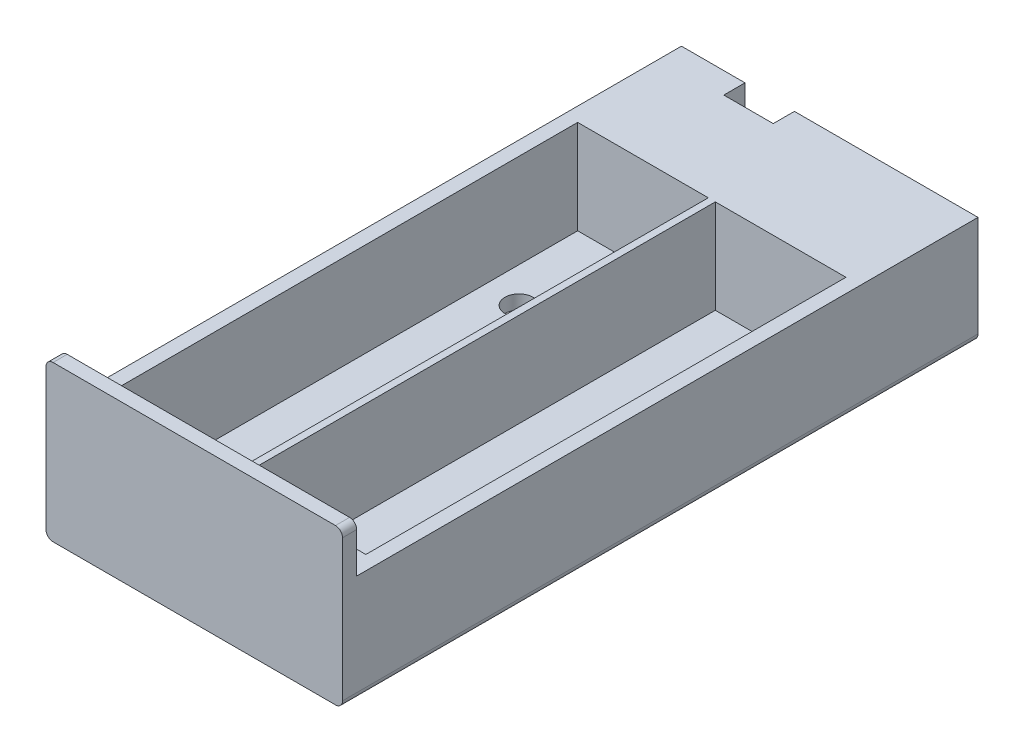
ISO-10303-21;
HEADER;
FILE_DESCRIPTION(('STEP AP214'),'2;1');
FILE_NAME('part.step','',(''),(''),'','','');
FILE_SCHEMA(('AUTOMOTIVE_DESIGN { 1 0 10303 214 1 1 1 1 }'));
ENDSEC;
DATA;
#1=APPLICATION_CONTEXT('core data for automotive mechanical design processes');
#2=APPLICATION_PROTOCOL_DEFINITION('international standard','automotive_design',2000,#1);
#3=PRODUCT_CONTEXT('',#1,'mechanical');
#4=PRODUCT('Part','Part','',(#3));
#5=PRODUCT_RELATED_PRODUCT_CATEGORY('part','',(#4));
#6=PRODUCT_DEFINITION_FORMATION('','',#4);
#7=PRODUCT_DEFINITION_CONTEXT('part definition',#1,'design');
#8=PRODUCT_DEFINITION('design','',#6,#7);
#9=PRODUCT_DEFINITION_SHAPE('','',#8);
#10=(LENGTH_UNIT() NAMED_UNIT(*) SI_UNIT(.MILLI.,.METRE.));
#11=(NAMED_UNIT(*) PLANE_ANGLE_UNIT() SI_UNIT($,.RADIAN.));
#12=(NAMED_UNIT(*) SI_UNIT($,.STERADIAN.) SOLID_ANGLE_UNIT());
#13=UNCERTAINTY_MEASURE_WITH_UNIT(LENGTH_MEASURE(1.E-05),#10,'distance_accuracy_value','');
#14=(GEOMETRIC_REPRESENTATION_CONTEXT(3) GLOBAL_UNCERTAINTY_ASSIGNED_CONTEXT((#13)) GLOBAL_UNIT_ASSIGNED_CONTEXT((#10,
#11,#12)) REPRESENTATION_CONTEXT('',''));
#15=CARTESIAN_POINT('',(0.,0.,0.));
#16=DIRECTION('',(0.,0.,1.));
#17=DIRECTION('',(1.,0.,0.));
#18=AXIS2_PLACEMENT_3D('',#15,#16,#17);
#19=CARTESIAN_POINT('',(-21.,22.,-45.));
#20=DIRECTION('',(0.,0.,1.));
#21=DIRECTION('',(1.,0.,0.));
#22=AXIS2_PLACEMENT_3D('',#19,#20,#21);
#23=PLANE('',#22);
#24=CARTESIAN_POINT('',(13.5,3.5,-45.));
#25=DIRECTION('',(0.,0.,-1.));
#26=DIRECTION('',(-1.,0.,0.));
#27=AXIS2_PLACEMENT_3D('',#24,#25,#26);
#28=CIRCLE('',#27,1.5);
#29=CARTESIAN_POINT('',(12.,3.5,-45.));
#30=VERTEX_POINT('',#29);
#31=EDGE_CURVE('E224',#30,#30,#28,.T.);
#32=ORIENTED_EDGE('',*,*,#31,.F.);
#33=EDGE_LOOP('',(#32));
#34=FACE_BOUND('',#33,.T.);
#35=DIRECTION('',(-1.,0.,0.));
#36=VECTOR('',#35,1.);
#37=CARTESIAN_POINT('',(-21.,15.3,-45.));
#38=LINE('',#37,#36);
#39=CARTESIAN_POINT('',(-12.,15.3,-45.));
#40=VERTEX_POINT('',#39);
#41=CARTESIAN_POINT('',(-21.,15.3,-45.));
#42=VERTEX_POINT('',#41);
#43=EDGE_CURVE('E236',#40,#42,#38,.T.);
#44=ORIENTED_EDGE('',*,*,#43,.F.);
#45=DIRECTION('',(0.,1.,0.));
#46=VECTOR('',#45,1.);
#47=CARTESIAN_POINT('',(-12.,15.3,-45.));
#48=LINE('',#47,#46);
#49=CARTESIAN_POINT('',(-12.,10.3,-45.));
#50=VERTEX_POINT('',#49);
#51=EDGE_CURVE('E368',#50,#40,#48,.T.);
#52=ORIENTED_EDGE('',*,*,#51,.F.);
#53=DIRECTION('',(-1.,0.,0.));
#54=VECTOR('',#53,1.);
#55=CARTESIAN_POINT('',(-12.,10.3,-45.));
#56=LINE('',#55,#54);
#57=CARTESIAN_POINT('',(-5.00000000000001,10.3,-45.));
#58=VERTEX_POINT('',#57);
#59=EDGE_CURVE('E375',#58,#50,#56,.T.);
#60=ORIENTED_EDGE('',*,*,#59,.F.);
#61=DIRECTION('',(0.,-1.,0.));
#62=VECTOR('',#61,1.);
#63=CARTESIAN_POINT('',(-5.00000000000001,15.3,-45.));
#64=LINE('',#63,#62);
#65=CARTESIAN_POINT('',(-5.00000000000001,15.3,-45.));
#66=VERTEX_POINT('',#65);
#67=EDGE_CURVE('E371',#66,#58,#64,.T.);
#68=ORIENTED_EDGE('',*,*,#67,.F.);
#69=CARTESIAN_POINT('',(21.,15.3,-45.));
#70=VERTEX_POINT('',#69);
#71=EDGE_CURVE('E215',#70,#66,#38,.T.);
#72=ORIENTED_EDGE('',*,*,#71,.F.);
#73=DIRECTION('',(0.,-1.,0.));
#74=VECTOR('',#73,1.);
#75=CARTESIAN_POINT('',(21.,22.,-45.));
#76=LINE('',#75,#74);
#77=CARTESIAN_POINT('',(21.,1.,-45.));
#78=VERTEX_POINT('',#77);
#79=EDGE_CURVE('E321',#70,#78,#76,.T.);
#80=ORIENTED_EDGE('',*,*,#79,.T.);
#81=CARTESIAN_POINT('',(20.,1.,-45.));
#82=DIRECTION('',(0.,0.,1.));
#83=DIRECTION('',(1.,0.,0.));
#84=AXIS2_PLACEMENT_3D('',#81,#82,#83);
#85=CIRCLE('',#84,1.);
#86=CARTESIAN_POINT('',(20.,0.,-45.));
#87=VERTEX_POINT('',#86);
#88=EDGE_CURVE('E331',#78,#87,#85,.F.);
#89=ORIENTED_EDGE('',*,*,#88,.T.);
#90=DIRECTION('',(-1.,0.,0.));
#91=VECTOR('',#90,1.);
#92=CARTESIAN_POINT('',(-21.,0.,-45.));
#93=LINE('',#92,#91);
#94=CARTESIAN_POINT('',(-20.,0.,-45.));
#95=VERTEX_POINT('',#94);
#96=EDGE_CURVE('E296',#87,#95,#93,.T.);
#97=ORIENTED_EDGE('',*,*,#96,.T.);
#98=CARTESIAN_POINT('',(-20.,1.,-45.));
#99=DIRECTION('',(0.,0.,1.));
#100=DIRECTION('',(1.,0.,0.));
#101=AXIS2_PLACEMENT_3D('',#98,#99,#100);
#102=CIRCLE('',#101,1.);
#103=CARTESIAN_POINT('',(-21.,1.,-45.));
#104=VERTEX_POINT('',#103);
#105=EDGE_CURVE('E328',#95,#104,#102,.F.);
#106=ORIENTED_EDGE('',*,*,#105,.T.);
#107=DIRECTION('',(0.,-1.,0.));
#108=VECTOR('',#107,1.);
#109=CARTESIAN_POINT('',(-21.,22.,-45.));
#110=LINE('',#109,#108);
#111=EDGE_CURVE('E319',#42,#104,#110,.T.);
#112=ORIENTED_EDGE('',*,*,#111,.F.);
#113=EDGE_LOOP('',(#44,#52,#60,#68,#72,#80,#89,#97,#106,#112));
#114=FACE_BOUND('',#113,.T.);
#115=ADVANCED_FACE('F42',(#34,#114),#23,.F.);
#116=CARTESIAN_POINT('',(0.,22.,0.));
#117=DIRECTION('',(0.,-1.,0.));
#118=DIRECTION('',(0.,0.,-1.));
#119=AXIS2_PLACEMENT_3D('',#116,#117,#118);
#120=PLANE('',#119);
#121=DIRECTION('',(0.,0.,-1.));
#122=VECTOR('',#121,1.);
#123=CARTESIAN_POINT('',(20.,22.,0.));
#124=LINE('',#123,#122);
#125=CARTESIAN_POINT('',(20.,22.,45.));
#126=VERTEX_POINT('',#125);
#127=CARTESIAN_POINT('',(20.,22.,43.));
#128=VERTEX_POINT('',#127);
#129=EDGE_CURVE('E353',#126,#128,#124,.T.);
#130=ORIENTED_EDGE('',*,*,#129,.T.);
#131=DIRECTION('',(1.,0.,0.));
#132=VECTOR('',#131,1.);
#133=CARTESIAN_POINT('',(-21.,22.,43.));
#134=LINE('',#133,#132);
#135=CARTESIAN_POINT('',(-20.,22.,43.));
#136=VERTEX_POINT('',#135);
#137=EDGE_CURVE('E227',#136,#128,#134,.T.);
#138=ORIENTED_EDGE('',*,*,#137,.F.);
#139=DIRECTION('',(0.,0.,1.));
#140=VECTOR('',#139,1.);
#141=CARTESIAN_POINT('',(-20.,22.,0.));
#142=LINE('',#141,#140);
#143=CARTESIAN_POINT('',(-20.,22.,45.));
#144=VERTEX_POINT('',#143);
#145=EDGE_CURVE('E351',#136,#144,#142,.T.);
#146=ORIENTED_EDGE('',*,*,#145,.T.);
#147=DIRECTION('',(1.,0.,0.));
#148=VECTOR('',#147,1.);
#149=CARTESIAN_POINT('',(-21.,22.,45.));
#150=LINE('',#149,#148);
#151=EDGE_CURVE('E305',#144,#126,#150,.T.);
#152=ORIENTED_EDGE('',*,*,#151,.T.);
#153=EDGE_LOOP('',(#130,#138,#146,#152));
#154=FACE_BOUND('',#153,.T.);
#155=ADVANCED_FACE('F402',(#154),#120,.F.);
#156=CARTESIAN_POINT('',(21.,22.,45.));
#157=DIRECTION('',(-1.,0.,0.));
#158=DIRECTION('',(0.,0.,1.));
#159=AXIS2_PLACEMENT_3D('',#156,#157,#158);
#160=PLANE('',#159);
#161=DIRECTION('',(0.,0.,-1.));
#162=VECTOR('',#161,1.);
#163=CARTESIAN_POINT('',(21.,15.3,-45.));
#164=LINE('',#163,#162);
#165=CARTESIAN_POINT('',(21.,15.3,43.));
#166=VERTEX_POINT('',#165);
#167=EDGE_CURVE('E234',#166,#70,#164,.T.);
#168=ORIENTED_EDGE('',*,*,#167,.F.);
#169=DIRECTION('',(0.,1.,0.));
#170=VECTOR('',#169,1.);
#171=CARTESIAN_POINT('',(21.,15.3,43.));
#172=LINE('',#171,#170);
#173=CARTESIAN_POINT('',(21.,21.,43.));
#174=VERTEX_POINT('',#173);
#175=EDGE_CURVE('E240',#166,#174,#172,.T.);
#176=ORIENTED_EDGE('',*,*,#175,.T.);
#177=DIRECTION('',(0.,0.,-1.));
#178=VECTOR('',#177,1.);
#179=CARTESIAN_POINT('',(21.,21.,45.));
#180=LINE('',#179,#178);
#181=CARTESIAN_POINT('',(21.,21.,45.));
#182=VERTEX_POINT('',#181);
#183=EDGE_CURVE('E323',#174,#182,#180,.F.);
#184=ORIENTED_EDGE('',*,*,#183,.T.);
#185=DIRECTION('',(0.,-1.,0.));
#186=VECTOR('',#185,1.);
#187=CARTESIAN_POINT('',(21.,22.,45.));
#188=LINE('',#187,#186);
#189=CARTESIAN_POINT('',(21.,1.,45.));
#190=VERTEX_POINT('',#189);
#191=EDGE_CURVE('E308',#182,#190,#188,.T.);
#192=ORIENTED_EDGE('',*,*,#191,.T.);
#193=DIRECTION('',(0.,0.,-1.));
#194=VECTOR('',#193,1.);
#195=CARTESIAN_POINT('',(21.,1.,-45.));
#196=LINE('',#195,#194);
#197=EDGE_CURVE('E325',#190,#78,#196,.T.);
#198=ORIENTED_EDGE('',*,*,#197,.T.);
#199=ORIENTED_EDGE('',*,*,#79,.F.);
#200=EDGE_LOOP('',(#168,#176,#184,#192,#198,#199));
#201=FACE_BOUND('',#200,.T.);
#202=ADVANCED_FACE('F412',(#201),#160,.F.);
#203=CARTESIAN_POINT('',(-21.,22.,45.));
#204=DIRECTION('',(1.,0.,0.));
#205=DIRECTION('',(0.,0.,-1.));
#206=AXIS2_PLACEMENT_3D('',#203,#204,#205);
#207=PLANE('',#206);
#208=DIRECTION('',(0.,0.,1.));
#209=VECTOR('',#208,1.);
#210=CARTESIAN_POINT('',(-21.,21.,45.));
#211=LINE('',#210,#209);
#212=CARTESIAN_POINT('',(-21.,21.,45.));
#213=VERTEX_POINT('',#212);
#214=CARTESIAN_POINT('',(-21.,21.,43.));
#215=VERTEX_POINT('',#214);
#216=EDGE_CURVE('E345',#213,#215,#211,.F.);
#217=ORIENTED_EDGE('',*,*,#216,.T.);
#218=DIRECTION('',(0.,1.,0.));
#219=VECTOR('',#218,1.);
#220=CARTESIAN_POINT('',(-21.,15.3,43.));
#221=LINE('',#220,#219);
#222=CARTESIAN_POINT('',(-21.,15.3,43.));
#223=VERTEX_POINT('',#222);
#224=EDGE_CURVE('E238',#223,#215,#221,.T.);
#225=ORIENTED_EDGE('',*,*,#224,.F.);
#226=DIRECTION('',(0.,0.,1.));
#227=VECTOR('',#226,1.);
#228=CARTESIAN_POINT('',(-21.,15.3,-45.));
#229=LINE('',#228,#227);
#230=EDGE_CURVE('E228',#42,#223,#229,.T.);
#231=ORIENTED_EDGE('',*,*,#230,.F.);
#232=ORIENTED_EDGE('',*,*,#111,.T.);
#233=DIRECTION('',(0.,0.,1.));
#234=VECTOR('',#233,1.);
#235=CARTESIAN_POINT('',(-21.,1.,45.));
#236=LINE('',#235,#234);
#237=CARTESIAN_POINT('',(-21.,1.,45.));
#238=VERTEX_POINT('',#237);
#239=EDGE_CURVE('E348',#104,#238,#236,.T.);
#240=ORIENTED_EDGE('',*,*,#239,.T.);
#241=DIRECTION('',(0.,-1.,0.));
#242=VECTOR('',#241,1.);
#243=CARTESIAN_POINT('',(-21.,22.,45.));
#244=LINE('',#243,#242);
#245=EDGE_CURVE('E316',#213,#238,#244,.T.);
#246=ORIENTED_EDGE('',*,*,#245,.F.);
#247=EDGE_LOOP('',(#217,#225,#231,#232,#240,#246));
#248=FACE_BOUND('',#247,.T.);
#249=ADVANCED_FACE('F390',(#248),#207,.F.);
#250=CARTESIAN_POINT('',(-21.,22.,45.));
#251=DIRECTION('',(0.,0.,-1.));
#252=DIRECTION('',(-1.,0.,0.));
#253=AXIS2_PLACEMENT_3D('',#250,#251,#252);
#254=PLANE('',#253);
#255=DIRECTION('',(1.,0.,0.));
#256=VECTOR('',#255,1.);
#257=CARTESIAN_POINT('',(-21.,0.,45.));
#258=LINE('',#257,#256);
#259=CARTESIAN_POINT('',(-20.,0.,45.));
#260=VERTEX_POINT('',#259);
#261=CARTESIAN_POINT('',(20.,0.,45.));
#262=VERTEX_POINT('',#261);
#263=EDGE_CURVE('E309',#260,#262,#258,.T.);
#264=ORIENTED_EDGE('',*,*,#263,.T.);
#265=CARTESIAN_POINT('',(20.,1.,45.));
#266=DIRECTION('',(0.,0.,-1.));
#267=DIRECTION('',(-1.,0.,0.));
#268=AXIS2_PLACEMENT_3D('',#265,#266,#267);
#269=CIRCLE('',#268,1.);
#270=EDGE_CURVE('E343',#262,#190,#269,.F.);
#271=ORIENTED_EDGE('',*,*,#270,.T.);
#272=ORIENTED_EDGE('',*,*,#191,.F.);
#273=CARTESIAN_POINT('',(20.,21.,45.));
#274=DIRECTION('',(0.,0.,-1.));
#275=DIRECTION('',(-1.,0.,0.));
#276=AXIS2_PLACEMENT_3D('',#273,#274,#275);
#277=CIRCLE('',#276,1.);
#278=EDGE_CURVE('E339',#182,#126,#277,.F.);
#279=ORIENTED_EDGE('',*,*,#278,.T.);
#280=ORIENTED_EDGE('',*,*,#151,.F.);
#281=CARTESIAN_POINT('',(-20.,21.,45.));
#282=DIRECTION('',(0.,0.,-1.));
#283=DIRECTION('',(-1.,0.,0.));
#284=AXIS2_PLACEMENT_3D('',#281,#282,#283);
#285=CIRCLE('',#284,1.);
#286=EDGE_CURVE('E337',#144,#213,#285,.F.);
#287=ORIENTED_EDGE('',*,*,#286,.T.);
#288=ORIENTED_EDGE('',*,*,#245,.T.);
#289=CARTESIAN_POINT('',(-20.,1.,45.));
#290=DIRECTION('',(0.,0.,-1.));
#291=DIRECTION('',(-1.,0.,0.));
#292=AXIS2_PLACEMENT_3D('',#289,#290,#291);
#293=CIRCLE('',#292,1.);
#294=EDGE_CURVE('E341',#238,#260,#293,.F.);
#295=ORIENTED_EDGE('',*,*,#294,.T.);
#296=EDGE_LOOP('',(#264,#271,#272,#279,#280,#287,#288,#295));
#297=FACE_BOUND('',#296,.T.);
#298=ADVANCED_FACE('F415',(#297),#254,.F.);
#299=CARTESIAN_POINT('',(0.,0.,0.));
#300=DIRECTION('',(0.,-1.,0.));
#301=DIRECTION('',(0.,0.,-1.));
#302=AXIS2_PLACEMENT_3D('',#299,#300,#301);
#303=PLANE('',#302);
#304=CARTESIAN_POINT('',(-14.,0.,-15.));
#305=DIRECTION('',(0.,-1.,0.));
#306=DIRECTION('',(0.,0.,-1.));
#307=AXIS2_PLACEMENT_3D('',#304,#305,#306);
#308=CIRCLE('',#307,2.);
#309=CARTESIAN_POINT('',(-14.,0.,-17.));
#310=VERTEX_POINT('',#309);
#311=EDGE_CURVE('E533',#310,#310,#308,.T.);
#312=ORIENTED_EDGE('',*,*,#311,.F.);
#313=EDGE_LOOP('',(#312));
#314=FACE_BOUND('',#313,.T.);
#315=CARTESIAN_POINT('',(-14.,0.,25.));
#316=DIRECTION('',(0.,-1.,0.));
#317=DIRECTION('',(0.,0.,-1.));
#318=AXIS2_PLACEMENT_3D('',#315,#316,#317);
#319=CIRCLE('',#318,2.);
#320=CARTESIAN_POINT('',(-14.,0.,23.));
#321=VERTEX_POINT('',#320);
#322=EDGE_CURVE('E528',#321,#321,#319,.T.);
#323=ORIENTED_EDGE('',*,*,#322,.F.);
#324=EDGE_LOOP('',(#323));
#325=FACE_BOUND('',#324,.T.);
#326=CARTESIAN_POINT('',(14.,0.,25.));
#327=DIRECTION('',(0.,-1.,0.));
#328=DIRECTION('',(0.,0.,-1.));
#329=AXIS2_PLACEMENT_3D('',#326,#327,#328);
#330=CIRCLE('',#329,2.00000000000001);
#331=CARTESIAN_POINT('',(14.,0.,23.));
#332=VERTEX_POINT('',#331);
#333=EDGE_CURVE('E526',#332,#332,#330,.T.);
#334=ORIENTED_EDGE('',*,*,#333,.F.);
#335=EDGE_LOOP('',(#334));
#336=FACE_BOUND('',#335,.T.);
#337=CARTESIAN_POINT('',(14.,0.,-15.));
#338=DIRECTION('',(0.,-1.,0.));
#339=DIRECTION('',(0.,0.,-1.));
#340=AXIS2_PLACEMENT_3D('',#337,#338,#339);
#341=CIRCLE('',#340,2.00000000000001);
#342=CARTESIAN_POINT('',(14.,0.,-17.));
#343=VERTEX_POINT('',#342);
#344=EDGE_CURVE('E361',#343,#343,#341,.T.);
#345=ORIENTED_EDGE('',*,*,#344,.F.);
#346=EDGE_LOOP('',(#345));
#347=FACE_BOUND('',#346,.T.);
#348=ORIENTED_EDGE('',*,*,#96,.F.);
#349=DIRECTION('',(0.,0.,-1.));
#350=VECTOR('',#349,1.);
#351=CARTESIAN_POINT('',(20.,0.,45.));
#352=LINE('',#351,#350);
#353=EDGE_CURVE('E335',#87,#262,#352,.F.);
#354=ORIENTED_EDGE('',*,*,#353,.T.);
#355=ORIENTED_EDGE('',*,*,#263,.F.);
#356=DIRECTION('',(0.,0.,1.));
#357=VECTOR('',#356,1.);
#358=CARTESIAN_POINT('',(-20.,0.,-45.));
#359=LINE('',#358,#357);
#360=EDGE_CURVE('E333',#260,#95,#359,.F.);
#361=ORIENTED_EDGE('',*,*,#360,.T.);
#362=EDGE_LOOP('',(#348,#354,#355,#361));
#363=FACE_BOUND('',#362,.T.);
#364=ADVANCED_FACE('F426',(#314,#325,#336,#347,#363),#303,.T.);
#365=CARTESIAN_POINT('',(20.,1.,45.));
#366=DIRECTION('',(0.,0.,1.));
#367=DIRECTION('',(1.,0.,0.));
#368=AXIS2_PLACEMENT_3D('',#365,#366,#367);
#369=CYLINDRICAL_SURFACE('',#368,1.);
#370=ORIENTED_EDGE('',*,*,#270,.F.);
#371=ORIENTED_EDGE('',*,*,#353,.F.);
#372=ORIENTED_EDGE('',*,*,#88,.F.);
#373=ORIENTED_EDGE('',*,*,#197,.F.);
#374=EDGE_LOOP('',(#370,#371,#372,#373));
#375=FACE_BOUND('',#374,.T.);
#376=ADVANCED_FACE('F420',(#375),#369,.T.);
#377=CARTESIAN_POINT('',(-20.,1.,45.));
#378=DIRECTION('',(0.,0.,-1.));
#379=DIRECTION('',(-1.,0.,0.));
#380=AXIS2_PLACEMENT_3D('',#377,#378,#379);
#381=CYLINDRICAL_SURFACE('',#380,1.);
#382=ORIENTED_EDGE('',*,*,#105,.F.);
#383=ORIENTED_EDGE('',*,*,#360,.F.);
#384=ORIENTED_EDGE('',*,*,#294,.F.);
#385=ORIENTED_EDGE('',*,*,#239,.F.);
#386=EDGE_LOOP('',(#382,#383,#384,#385));
#387=FACE_BOUND('',#386,.T.);
#388=ADVANCED_FACE('F429',(#387),#381,.T.);
#389=CARTESIAN_POINT('',(20.,21.,0.));
#390=DIRECTION('',(0.,0.,-1.));
#391=DIRECTION('',(-1.,0.,0.));
#392=AXIS2_PLACEMENT_3D('',#389,#390,#391);
#393=CYLINDRICAL_SURFACE('',#392,1.);
#394=CARTESIAN_POINT('',(20.,21.,43.));
#395=DIRECTION('',(0.,0.,1.));
#396=DIRECTION('',(1.,0.,0.));
#397=AXIS2_PLACEMENT_3D('',#394,#395,#396);
#398=CIRCLE('',#397,1.);
#399=EDGE_CURVE('E261',#128,#174,#398,.F.);
#400=ORIENTED_EDGE('',*,*,#399,.F.);
#401=ORIENTED_EDGE('',*,*,#129,.F.);
#402=ORIENTED_EDGE('',*,*,#278,.F.);
#403=ORIENTED_EDGE('',*,*,#183,.F.);
#404=EDGE_LOOP('',(#400,#401,#402,#403));
#405=FACE_BOUND('',#404,.T.);
#406=ADVANCED_FACE('F407',(#405),#393,.T.);
#407=CARTESIAN_POINT('',(-20.,21.,0.));
#408=DIRECTION('',(0.,0.,1.));
#409=DIRECTION('',(1.,0.,0.));
#410=AXIS2_PLACEMENT_3D('',#407,#408,#409);
#411=CYLINDRICAL_SURFACE('',#410,1.);
#412=CARTESIAN_POINT('',(-20.,21.,43.));
#413=DIRECTION('',(0.,0.,1.));
#414=DIRECTION('',(1.,0.,0.));
#415=AXIS2_PLACEMENT_3D('',#412,#413,#414);
#416=CIRCLE('',#415,1.);
#417=EDGE_CURVE('E11',#215,#136,#416,.F.);
#418=ORIENTED_EDGE('',*,*,#417,.F.);
#419=ORIENTED_EDGE('',*,*,#216,.F.);
#420=ORIENTED_EDGE('',*,*,#286,.F.);
#421=ORIENTED_EDGE('',*,*,#145,.F.);
#422=EDGE_LOOP('',(#418,#419,#420,#421));
#423=FACE_BOUND('',#422,.T.);
#424=ADVANCED_FACE('F44',(#423),#411,.T.);
#425=CARTESIAN_POINT('',(0.,15.3,0.));
#426=DIRECTION('',(0.,1.,0.));
#427=DIRECTION('',(0.,0.,1.));
#428=AXIS2_PLACEMENT_3D('',#425,#426,#427);
#429=PLANE('',#428);
#430=DIRECTION('',(0.,0.,-1.));
#431=VECTOR('',#430,1.);
#432=CARTESIAN_POINT('',(-12.,15.3,-42.));
#433=LINE('',#432,#431);
#434=CARTESIAN_POINT('',(-12.,15.3,-42.));
#435=VERTEX_POINT('',#434);
#436=EDGE_CURVE('E216',#435,#40,#433,.T.);
#437=ORIENTED_EDGE('',*,*,#436,.T.);
#438=ORIENTED_EDGE('',*,*,#43,.T.);
#439=ORIENTED_EDGE('',*,*,#230,.T.);
#440=DIRECTION('',(1.,0.,0.));
#441=VECTOR('',#440,1.);
#442=CARTESIAN_POINT('',(-21.,15.3,43.));
#443=LINE('',#442,#441);
#444=EDGE_CURVE('E231',#223,#166,#443,.T.);
#445=ORIENTED_EDGE('',*,*,#444,.T.);
#446=ORIENTED_EDGE('',*,*,#167,.T.);
#447=ORIENTED_EDGE('',*,*,#71,.T.);
#448=DIRECTION('',(0.,0.,-1.));
#449=VECTOR('',#448,1.);
#450=CARTESIAN_POINT('',(-5.00000000000001,15.3,-42.));
#451=LINE('',#450,#449);
#452=CARTESIAN_POINT('',(-5.00000000000001,15.3,-42.));
#453=VERTEX_POINT('',#452);
#454=EDGE_CURVE('E199',#453,#66,#451,.T.);
#455=ORIENTED_EDGE('',*,*,#454,.F.);
#456=DIRECTION('',(1.,0.,0.));
#457=VECTOR('',#456,1.);
#458=CARTESIAN_POINT('',(-12.,15.3,-42.));
#459=LINE('',#458,#457);
#460=EDGE_CURVE('E204',#435,#453,#459,.T.);
#461=ORIENTED_EDGE('',*,*,#460,.F.);
#462=EDGE_LOOP('',(#437,#438,#439,#445,#446,#447,#455,#461));
#463=FACE_BOUND('',#462,.T.);
#464=DIRECTION('',(-1.,0.,0.));
#465=VECTOR('',#464,1.);
#466=CARTESIAN_POINT('',(0.,15.3,39.7));
#467=LINE('',#466,#465);
#468=CARTESIAN_POINT('',(19.,15.3,39.7));
#469=VERTEX_POINT('',#468);
#470=CARTESIAN_POINT('',(0.500000000000008,15.3,39.7));
#471=VERTEX_POINT('',#470);
#472=EDGE_CURVE('E256',#469,#471,#467,.T.);
#473=ORIENTED_EDGE('',*,*,#472,.T.);
#474=DIRECTION('',(0.,0.,-1.));
#475=VECTOR('',#474,1.);
#476=CARTESIAN_POINT('',(0.5,15.3,-28.3));
#477=LINE('',#476,#475);
#478=CARTESIAN_POINT('',(0.5,15.3,-28.3));
#479=VERTEX_POINT('',#478);
#480=EDGE_CURVE('E251',#471,#479,#477,.T.);
#481=ORIENTED_EDGE('',*,*,#480,.T.);
#482=DIRECTION('',(-1.,0.,0.));
#483=VECTOR('',#482,1.);
#484=CARTESIAN_POINT('',(0.,15.3,-28.3));
#485=LINE('',#484,#483);
#486=CARTESIAN_POINT('',(19.,15.3,-28.3));
#487=VERTEX_POINT('',#486);
#488=EDGE_CURVE('E253',#487,#479,#485,.T.);
#489=ORIENTED_EDGE('',*,*,#488,.F.);
#490=DIRECTION('',(0.,0.,-1.));
#491=VECTOR('',#490,1.);
#492=CARTESIAN_POINT('',(19.,15.3,0.));
#493=LINE('',#492,#491);
#494=EDGE_CURVE('E258',#469,#487,#493,.T.);
#495=ORIENTED_EDGE('',*,*,#494,.F.);
#496=EDGE_LOOP('',(#473,#481,#489,#495));
#497=FACE_BOUND('',#496,.T.);
#498=DIRECTION('',(0.,0.,-1.));
#499=VECTOR('',#498,1.);
#500=CARTESIAN_POINT('',(-19.,15.3,0.));
#501=LINE('',#500,#499);
#502=CARTESIAN_POINT('',(-19.,15.3,39.7));
#503=VERTEX_POINT('',#502);
#504=CARTESIAN_POINT('',(-19.,15.3,-28.3));
#505=VERTEX_POINT('',#504);
#506=EDGE_CURVE('E249',#503,#505,#501,.T.);
#507=ORIENTED_EDGE('',*,*,#506,.T.);
#508=DIRECTION('',(-1.,0.,0.));
#509=VECTOR('',#508,1.);
#510=CARTESIAN_POINT('',(0.,15.3,-28.3));
#511=LINE('',#510,#509);
#512=CARTESIAN_POINT('',(-0.5,15.3,-28.3));
#513=VERTEX_POINT('',#512);
#514=EDGE_CURVE('E243',#513,#505,#511,.T.);
#515=ORIENTED_EDGE('',*,*,#514,.F.);
#516=DIRECTION('',(0.,0.,1.));
#517=VECTOR('',#516,1.);
#518=CARTESIAN_POINT('',(-0.5,15.3,-28.3));
#519=LINE('',#518,#517);
#520=CARTESIAN_POINT('',(-0.499999999999992,15.3,39.7));
#521=VERTEX_POINT('',#520);
#522=EDGE_CURVE('E51',#513,#521,#519,.T.);
#523=ORIENTED_EDGE('',*,*,#522,.T.);
#524=DIRECTION('',(-1.,0.,0.));
#525=VECTOR('',#524,1.);
#526=CARTESIAN_POINT('',(0.,15.3,39.7));
#527=LINE('',#526,#525);
#528=EDGE_CURVE('E247',#521,#503,#527,.T.);
#529=ORIENTED_EDGE('',*,*,#528,.T.);
#530=EDGE_LOOP('',(#507,#515,#523,#529));
#531=FACE_BOUND('',#530,.T.);
#532=ADVANCED_FACE('F212',(#463,#497,#531),#429,.T.);
#533=CARTESIAN_POINT('',(-21.,15.3,43.));
#534=DIRECTION('',(0.,0.,1.));
#535=DIRECTION('',(1.,0.,0.));
#536=AXIS2_PLACEMENT_3D('',#533,#534,#535);
#537=PLANE('',#536);
#538=ORIENTED_EDGE('',*,*,#399,.T.);
#539=ORIENTED_EDGE('',*,*,#175,.F.);
#540=ORIENTED_EDGE('',*,*,#444,.F.);
#541=ORIENTED_EDGE('',*,*,#224,.T.);
#542=ORIENTED_EDGE('',*,*,#417,.T.);
#543=ORIENTED_EDGE('',*,*,#137,.T.);
#544=EDGE_LOOP('',(#538,#539,#540,#541,#542,#543));
#545=FACE_BOUND('',#544,.T.);
#546=ADVANCED_FACE('F395',(#545),#537,.F.);
#547=CARTESIAN_POINT('',(0.,2.,0.));
#548=DIRECTION('',(0.,1.,0.));
#549=DIRECTION('',(0.,0.,1.));
#550=AXIS2_PLACEMENT_3D('',#547,#548,#549);
#551=PLANE('',#550);
#552=CARTESIAN_POINT('',(14.,2.,25.));
#553=DIRECTION('',(0.,1.,0.));
#554=DIRECTION('',(0.,0.,1.));
#555=AXIS2_PLACEMENT_3D('',#552,#553,#554);
#556=CIRCLE('',#555,2.00000000000001);
#557=CARTESIAN_POINT('',(14.,2.,27.));
#558=VERTEX_POINT('',#557);
#559=EDGE_CURVE('E46',#558,#558,#556,.T.);
#560=ORIENTED_EDGE('',*,*,#559,.F.);
#561=EDGE_LOOP('',(#560));
#562=FACE_BOUND('',#561,.T.);
#563=CARTESIAN_POINT('',(14.,2.,-15.));
#564=DIRECTION('',(0.,1.,0.));
#565=DIRECTION('',(0.,0.,1.));
#566=AXIS2_PLACEMENT_3D('',#563,#564,#565);
#567=CIRCLE('',#566,2.00000000000001);
#568=CARTESIAN_POINT('',(14.,2.,-13.));
#569=VERTEX_POINT('',#568);
#570=EDGE_CURVE('E363',#569,#569,#567,.T.);
#571=ORIENTED_EDGE('',*,*,#570,.F.);
#572=EDGE_LOOP('',(#571));
#573=FACE_BOUND('',#572,.T.);
#574=DIRECTION('',(1.,0.,0.));
#575=VECTOR('',#574,1.);
#576=CARTESIAN_POINT('',(0.,2.,-28.3));
#577=LINE('',#576,#575);
#578=CARTESIAN_POINT('',(0.5,2.,-28.3));
#579=VERTEX_POINT('',#578);
#580=CARTESIAN_POINT('',(13.5,2.,-28.3));
#581=VERTEX_POINT('',#580);
#582=EDGE_CURVE('E285',#579,#581,#577,.T.);
#583=ORIENTED_EDGE('',*,*,#582,.F.);
#584=DIRECTION('',(0.,0.,-1.));
#585=VECTOR('',#584,1.);
#586=CARTESIAN_POINT('',(0.5,2.,-28.3));
#587=LINE('',#586,#585);
#588=CARTESIAN_POINT('',(0.500000000000008,2.,39.7));
#589=VERTEX_POINT('',#588);
#590=EDGE_CURVE('E266',#589,#579,#587,.T.);
#591=ORIENTED_EDGE('',*,*,#590,.F.);
#592=DIRECTION('',(1.,0.,0.));
#593=VECTOR('',#592,1.);
#594=CARTESIAN_POINT('',(0.,2.,39.7));
#595=LINE('',#594,#593);
#596=CARTESIAN_POINT('',(19.,2.,39.7));
#597=VERTEX_POINT('',#596);
#598=EDGE_CURVE('E288',#589,#597,#595,.T.);
#599=ORIENTED_EDGE('',*,*,#598,.T.);
#600=DIRECTION('',(0.,0.,1.));
#601=VECTOR('',#600,1.);
#602=CARTESIAN_POINT('',(19.,2.,0.));
#603=LINE('',#602,#601);
#604=CARTESIAN_POINT('',(19.,2.,-28.3));
#605=VERTEX_POINT('',#604);
#606=EDGE_CURVE('E277',#605,#597,#603,.T.);
#607=ORIENTED_EDGE('',*,*,#606,.F.);
#608=EDGE_CURVE('E280',#581,#605,#577,.T.);
#609=ORIENTED_EDGE('',*,*,#608,.F.);
#610=EDGE_LOOP('',(#583,#591,#599,#607,#609));
#611=FACE_BOUND('',#610,.T.);
#612=ADVANCED_FACE('F485',(#562,#573,#611),#551,.T.);
#613=CARTESIAN_POINT('',(0.5,90.0073525436772,-28.3));
#614=DIRECTION('',(-1.,0.,0.));
#615=DIRECTION('',(0.,0.,1.));
#616=AXIS2_PLACEMENT_3D('',#613,#614,#615);
#617=PLANE('',#616);
#618=ORIENTED_EDGE('',*,*,#480,.F.);
#619=DIRECTION('',(0.,-1.,0.));
#620=VECTOR('',#619,1.);
#621=CARTESIAN_POINT('',(0.500000000000008,90.0073525436772,39.7));
#622=LINE('',#621,#620);
#623=EDGE_CURVE('E273',#471,#589,#622,.T.);
#624=ORIENTED_EDGE('',*,*,#623,.T.);
#625=ORIENTED_EDGE('',*,*,#590,.T.);
#626=DIRECTION('',(0.,-1.,0.));
#627=VECTOR('',#626,1.);
#628=CARTESIAN_POINT('',(0.5,90.0073525436772,-28.3));
#629=LINE('',#628,#627);
#630=EDGE_CURVE('E271',#479,#579,#629,.T.);
#631=ORIENTED_EDGE('',*,*,#630,.F.);
#632=EDGE_LOOP('',(#618,#624,#625,#631));
#633=FACE_BOUND('',#632,.T.);
#634=ADVANCED_FACE('F468',(#633),#617,.F.);
#635=CARTESIAN_POINT('',(19.,2.,0.));
#636=DIRECTION('',(-1.,0.,0.));
#637=DIRECTION('',(0.,0.,1.));
#638=AXIS2_PLACEMENT_3D('',#635,#636,#637);
#639=PLANE('',#638);
#640=DIRECTION('',(0.,1.,0.));
#641=VECTOR('',#640,1.);
#642=CARTESIAN_POINT('',(19.,2.,39.7));
#643=LINE('',#642,#641);
#644=EDGE_CURVE('E293',#597,#469,#643,.T.);
#645=ORIENTED_EDGE('',*,*,#644,.T.);
#646=ORIENTED_EDGE('',*,*,#494,.T.);
#647=DIRECTION('',(0.,1.,0.));
#648=VECTOR('',#647,1.);
#649=CARTESIAN_POINT('',(19.,2.,-28.3));
#650=LINE('',#649,#648);
#651=EDGE_CURVE('E292',#605,#487,#650,.T.);
#652=ORIENTED_EDGE('',*,*,#651,.F.);
#653=ORIENTED_EDGE('',*,*,#606,.T.);
#654=EDGE_LOOP('',(#645,#646,#652,#653));
#655=FACE_BOUND('',#654,.T.);
#656=ADVANCED_FACE('F464',(#655),#639,.T.);
#657=CARTESIAN_POINT('',(0.,2.,-28.3));
#658=DIRECTION('',(0.,0.,1.));
#659=DIRECTION('',(1.,0.,0.));
#660=AXIS2_PLACEMENT_3D('',#657,#658,#659);
#661=PLANE('',#660);
#662=ORIENTED_EDGE('',*,*,#582,.T.);
#663=CARTESIAN_POINT('',(13.5,3.5,-28.3));
#664=DIRECTION('',(0.,0.,1.));
#665=DIRECTION('',(1.,0.,0.));
#666=AXIS2_PLACEMENT_3D('',#663,#664,#665);
#667=CIRCLE('',#666,1.5);
#668=EDGE_CURVE('E65',#581,#581,#667,.F.);
#669=ORIENTED_EDGE('',*,*,#668,.T.);
#670=ORIENTED_EDGE('',*,*,#608,.T.);
#671=ORIENTED_EDGE('',*,*,#651,.T.);
#672=ORIENTED_EDGE('',*,*,#488,.T.);
#673=ORIENTED_EDGE('',*,*,#630,.T.);
#674=EDGE_LOOP('',(#662,#669,#670,#671,#672,#673));
#675=FACE_BOUND('',#674,.T.);
#676=ADVANCED_FACE('F467',(#675),#661,.T.);
#677=CARTESIAN_POINT('',(0.,2.,39.7));
#678=DIRECTION('',(0.,0.,1.));
#679=DIRECTION('',(1.,0.,0.));
#680=AXIS2_PLACEMENT_3D('',#677,#678,#679);
#681=PLANE('',#680);
#682=ORIENTED_EDGE('',*,*,#472,.F.);
#683=ORIENTED_EDGE('',*,*,#644,.F.);
#684=ORIENTED_EDGE('',*,*,#598,.F.);
#685=ORIENTED_EDGE('',*,*,#623,.F.);
#686=EDGE_LOOP('',(#682,#683,#684,#685));
#687=FACE_BOUND('',#686,.T.);
#688=ADVANCED_FACE('F472',(#687),#681,.F.);
#689=CARTESIAN_POINT('',(-14.,2.,-15.));
#690=DIRECTION('',(0.,1.,0.));
#691=DIRECTION('',(0.,0.,1.));
#692=AXIS2_PLACEMENT_3D('',#689,#690,#691);
#693=CIRCLE('',#692,2.);
#694=CARTESIAN_POINT('',(-14.,2.,-13.));
#695=VERTEX_POINT('',#694);
#696=EDGE_CURVE('E360',#695,#695,#693,.T.);
#697=ORIENTED_EDGE('',*,*,#696,.F.);
#698=EDGE_LOOP('',(#697));
#699=FACE_BOUND('',#698,.T.);
#700=CARTESIAN_POINT('',(-14.,2.,25.));
#701=DIRECTION('',(0.,1.,0.));
#702=DIRECTION('',(0.,0.,1.));
#703=AXIS2_PLACEMENT_3D('',#700,#701,#702);
#704=CIRCLE('',#703,2.);
#705=CARTESIAN_POINT('',(-14.,2.,27.));
#706=VERTEX_POINT('',#705);
#707=EDGE_CURVE('E357',#706,#706,#704,.T.);
#708=ORIENTED_EDGE('',*,*,#707,.F.);
#709=EDGE_LOOP('',(#708));
#710=FACE_BOUND('',#709,.T.);
#711=CARTESIAN_POINT('',(-19.,2.,39.7));
#712=VERTEX_POINT('',#711);
#713=CARTESIAN_POINT('',(-0.499999999999992,2.,39.7));
#714=VERTEX_POINT('',#713);
#715=EDGE_CURVE('E289',#712,#714,#595,.T.);
#716=ORIENTED_EDGE('',*,*,#715,.T.);
#717=DIRECTION('',(0.,0.,1.));
#718=VECTOR('',#717,1.);
#719=CARTESIAN_POINT('',(-0.5,2.,-28.3));
#720=LINE('',#719,#718);
#721=CARTESIAN_POINT('',(-0.499999999999996,2.,-28.3));
#722=VERTEX_POINT('',#721);
#723=EDGE_CURVE('E263',#722,#714,#720,.T.);
#724=ORIENTED_EDGE('',*,*,#723,.F.);
#725=CARTESIAN_POINT('',(-19.,2.,-28.3));
#726=VERTEX_POINT('',#725);
#727=EDGE_CURVE('E281',#726,#722,#577,.T.);
#728=ORIENTED_EDGE('',*,*,#727,.F.);
#729=DIRECTION('',(0.,0.,1.));
#730=VECTOR('',#729,1.);
#731=CARTESIAN_POINT('',(-19.,2.,0.));
#732=LINE('',#731,#730);
#733=EDGE_CURVE('E284',#726,#712,#732,.T.);
#734=ORIENTED_EDGE('',*,*,#733,.T.);
#735=EDGE_LOOP('',(#716,#724,#728,#734));
#736=FACE_BOUND('',#735,.T.);
#737=ADVANCED_FACE('F479',(#699,#710,#736),#551,.T.);
#738=CARTESIAN_POINT('',(-19.,2.,0.));
#739=DIRECTION('',(-1.,0.,0.));
#740=DIRECTION('',(0.,0.,1.));
#741=AXIS2_PLACEMENT_3D('',#738,#739,#740);
#742=PLANE('',#741);
#743=ORIENTED_EDGE('',*,*,#506,.F.);
#744=DIRECTION('',(0.,1.,0.));
#745=VECTOR('',#744,1.);
#746=CARTESIAN_POINT('',(-19.,2.,39.7));
#747=LINE('',#746,#745);
#748=EDGE_CURVE('E297',#712,#503,#747,.T.);
#749=ORIENTED_EDGE('',*,*,#748,.F.);
#750=ORIENTED_EDGE('',*,*,#733,.F.);
#751=DIRECTION('',(0.,1.,0.));
#752=VECTOR('',#751,1.);
#753=CARTESIAN_POINT('',(-19.,2.,-28.3));
#754=LINE('',#753,#752);
#755=EDGE_CURVE('E300',#726,#505,#754,.T.);
#756=ORIENTED_EDGE('',*,*,#755,.T.);
#757=EDGE_LOOP('',(#743,#749,#750,#756));
#758=FACE_BOUND('',#757,.T.);
#759=ADVANCED_FACE('F475',(#758),#742,.F.);
#760=CARTESIAN_POINT('',(-0.5,90.0073525436772,-28.3));
#761=DIRECTION('',(1.,0.,0.));
#762=DIRECTION('',(0.,0.,-1.));
#763=AXIS2_PLACEMENT_3D('',#760,#761,#762);
#764=PLANE('',#763);
#765=ORIENTED_EDGE('',*,*,#522,.F.);
#766=DIRECTION('',(0.,-1.,0.));
#767=VECTOR('',#766,1.);
#768=CARTESIAN_POINT('',(-0.5,90.0073525436772,-28.3));
#769=LINE('',#768,#767);
#770=EDGE_CURVE('E269',#513,#722,#769,.T.);
#771=ORIENTED_EDGE('',*,*,#770,.T.);
#772=ORIENTED_EDGE('',*,*,#723,.T.);
#773=DIRECTION('',(0.,-1.,0.));
#774=VECTOR('',#773,1.);
#775=CARTESIAN_POINT('',(-0.499999999999992,90.0073525436772,39.7));
#776=LINE('',#775,#774);
#777=EDGE_CURVE('E275',#521,#714,#776,.T.);
#778=ORIENTED_EDGE('',*,*,#777,.F.);
#779=EDGE_LOOP('',(#765,#771,#772,#778));
#780=FACE_BOUND('',#779,.T.);
#781=ADVANCED_FACE('F478',(#780),#764,.F.);
#782=ORIENTED_EDGE('',*,*,#770,.F.);
#783=ORIENTED_EDGE('',*,*,#514,.T.);
#784=ORIENTED_EDGE('',*,*,#755,.F.);
#785=ORIENTED_EDGE('',*,*,#727,.T.);
#786=EDGE_LOOP('',(#782,#783,#784,#785));
#787=FACE_BOUND('',#786,.T.);
#788=ADVANCED_FACE('F474',(#787),#661,.T.);
#789=ORIENTED_EDGE('',*,*,#528,.F.);
#790=ORIENTED_EDGE('',*,*,#777,.T.);
#791=ORIENTED_EDGE('',*,*,#715,.F.);
#792=ORIENTED_EDGE('',*,*,#748,.T.);
#793=EDGE_LOOP('',(#789,#790,#791,#792));
#794=FACE_BOUND('',#793,.T.);
#795=ADVANCED_FACE('F484',(#794),#681,.F.);
#796=CARTESIAN_POINT('',(13.5,3.5,45.001));
#797=DIRECTION('',(0.,0.,-1.));
#798=DIRECTION('',(-1.,0.,0.));
#799=AXIS2_PLACEMENT_3D('',#796,#797,#798);
#800=CYLINDRICAL_SURFACE('',#799,1.5);
#801=ORIENTED_EDGE('',*,*,#668,.F.);
#802=EDGE_LOOP('',(#801));
#803=FACE_BOUND('',#802,.T.);
#804=ORIENTED_EDGE('',*,*,#31,.T.);
#805=EDGE_LOOP('',(#804));
#806=FACE_BOUND('',#805,.T.);
#807=ADVANCED_FACE('F498',(#803,#806),#800,.F.);
#808=CARTESIAN_POINT('',(-12.,15.3,-42.));
#809=DIRECTION('',(-1.,0.,0.));
#810=DIRECTION('',(0.,-1.,0.));
#811=AXIS2_PLACEMENT_3D('',#808,#809,#810);
#812=PLANE('',#811);
#813=ORIENTED_EDGE('',*,*,#51,.T.);
#814=ORIENTED_EDGE('',*,*,#436,.F.);
#815=DIRECTION('',(0.,1.,0.));
#816=VECTOR('',#815,1.);
#817=CARTESIAN_POINT('',(-12.,15.3,-42.));
#818=LINE('',#817,#816);
#819=CARTESIAN_POINT('',(-12.,10.3,-42.));
#820=VERTEX_POINT('',#819);
#821=EDGE_CURVE('E59',#820,#435,#818,.T.);
#822=ORIENTED_EDGE('',*,*,#821,.F.);
#823=DIRECTION('',(0.,0.,-1.));
#824=VECTOR('',#823,1.);
#825=CARTESIAN_POINT('',(-12.,10.3,-42.));
#826=LINE('',#825,#824);
#827=EDGE_CURVE('E218',#820,#50,#826,.T.);
#828=ORIENTED_EDGE('',*,*,#827,.T.);
#829=EDGE_LOOP('',(#813,#814,#822,#828));
#830=FACE_BOUND('',#829,.T.);
#831=ADVANCED_FACE('F380',(#830),#812,.F.);
#832=CARTESIAN_POINT('',(-12.,10.3,-42.));
#833=DIRECTION('',(0.,-1.,0.));
#834=DIRECTION('',(1.,0.,0.));
#835=AXIS2_PLACEMENT_3D('',#832,#833,#834);
#836=PLANE('',#835);
#837=ORIENTED_EDGE('',*,*,#59,.T.);
#838=ORIENTED_EDGE('',*,*,#827,.F.);
#839=DIRECTION('',(-1.,0.,0.));
#840=VECTOR('',#839,1.);
#841=CARTESIAN_POINT('',(-12.,10.3,-42.));
#842=LINE('',#841,#840);
#843=CARTESIAN_POINT('',(-5.00000000000001,10.3,-42.));
#844=VERTEX_POINT('',#843);
#845=EDGE_CURVE('E203',#844,#820,#842,.T.);
#846=ORIENTED_EDGE('',*,*,#845,.F.);
#847=DIRECTION('',(0.,0.,-1.));
#848=VECTOR('',#847,1.);
#849=CARTESIAN_POINT('',(-5.00000000000001,10.3,-42.));
#850=LINE('',#849,#848);
#851=EDGE_CURVE('E201',#844,#58,#850,.T.);
#852=ORIENTED_EDGE('',*,*,#851,.T.);
#853=EDGE_LOOP('',(#837,#838,#846,#852));
#854=FACE_BOUND('',#853,.T.);
#855=ADVANCED_FACE('F383',(#854),#836,.F.);
#856=CARTESIAN_POINT('',(-5.00000000000001,15.3,-42.));
#857=DIRECTION('',(1.,0.,0.));
#858=DIRECTION('',(0.,0.,-1.));
#859=AXIS2_PLACEMENT_3D('',#856,#857,#858);
#860=PLANE('',#859);
#861=ORIENTED_EDGE('',*,*,#67,.T.);
#862=ORIENTED_EDGE('',*,*,#851,.F.);
#863=DIRECTION('',(0.,-1.,0.));
#864=VECTOR('',#863,1.);
#865=CARTESIAN_POINT('',(-5.00000000000001,15.3,-42.));
#866=LINE('',#865,#864);
#867=EDGE_CURVE('E195',#453,#844,#866,.T.);
#868=ORIENTED_EDGE('',*,*,#867,.F.);
#869=ORIENTED_EDGE('',*,*,#454,.T.);
#870=EDGE_LOOP('',(#861,#862,#868,#869));
#871=FACE_BOUND('',#870,.T.);
#872=ADVANCED_FACE('F197',(#871),#860,.F.);
#873=CARTESIAN_POINT('',(0.,0.,-42.));
#874=DIRECTION('',(0.,0.,1.));
#875=DIRECTION('',(1.,0.,0.));
#876=AXIS2_PLACEMENT_3D('',#873,#874,#875);
#877=PLANE('',#876);
#878=ORIENTED_EDGE('',*,*,#821,.T.);
#879=ORIENTED_EDGE('',*,*,#460,.T.);
#880=ORIENTED_EDGE('',*,*,#867,.T.);
#881=ORIENTED_EDGE('',*,*,#845,.T.);
#882=EDGE_LOOP('',(#878,#879,#880,#881));
#883=FACE_BOUND('',#882,.T.);
#884=ADVANCED_FACE('F207',(#883),#877,.F.);
#885=CARTESIAN_POINT('',(-14.,22.,25.));
#886=DIRECTION('',(0.,-1.,0.));
#887=DIRECTION('',(0.,0.,-1.));
#888=AXIS2_PLACEMENT_3D('',#885,#886,#887);
#889=CYLINDRICAL_SURFACE('',#888,2.);
#890=ORIENTED_EDGE('',*,*,#707,.T.);
#891=EDGE_LOOP('',(#890));
#892=FACE_BOUND('',#891,.T.);
#893=ORIENTED_EDGE('',*,*,#322,.T.);
#894=EDGE_LOOP('',(#893));
#895=FACE_BOUND('',#894,.T.);
#896=ADVANCED_FACE('F508',(#892,#895),#889,.F.);
#897=CARTESIAN_POINT('',(-14.,22.,-15.));
#898=DIRECTION('',(0.,-1.,0.));
#899=DIRECTION('',(0.,0.,-1.));
#900=AXIS2_PLACEMENT_3D('',#897,#898,#899);
#901=CYLINDRICAL_SURFACE('',#900,2.);
#902=ORIENTED_EDGE('',*,*,#696,.T.);
#903=EDGE_LOOP('',(#902));
#904=FACE_BOUND('',#903,.T.);
#905=ORIENTED_EDGE('',*,*,#311,.T.);
#906=EDGE_LOOP('',(#905));
#907=FACE_BOUND('',#906,.T.);
#908=ADVANCED_FACE('F513',(#904,#907),#901,.F.);
#909=CARTESIAN_POINT('',(14.,22.,-15.));
#910=DIRECTION('',(0.,-1.,0.));
#911=DIRECTION('',(0.,0.,-1.));
#912=AXIS2_PLACEMENT_3D('',#909,#910,#911);
#913=CYLINDRICAL_SURFACE('',#912,2.00000000000001);
#914=ORIENTED_EDGE('',*,*,#570,.T.);
#915=EDGE_LOOP('',(#914));
#916=FACE_BOUND('',#915,.T.);
#917=ORIENTED_EDGE('',*,*,#344,.T.);
#918=EDGE_LOOP('',(#917));
#919=FACE_BOUND('',#918,.T.);
#920=ADVANCED_FACE('F509',(#916,#919),#913,.F.);
#921=CARTESIAN_POINT('',(14.,22.,25.));
#922=DIRECTION('',(0.,-1.,0.));
#923=DIRECTION('',(0.,0.,-1.));
#924=AXIS2_PLACEMENT_3D('',#921,#922,#923);
#925=CYLINDRICAL_SURFACE('',#924,2.00000000000001);
#926=ORIENTED_EDGE('',*,*,#559,.T.);
#927=EDGE_LOOP('',(#926));
#928=FACE_BOUND('',#927,.T.);
#929=ORIENTED_EDGE('',*,*,#333,.T.);
#930=EDGE_LOOP('',(#929));
#931=FACE_BOUND('',#930,.T.);
#932=ADVANCED_FACE('F512',(#928,#931),#925,.F.);
#933=CLOSED_SHELL('',(#115,#155,#202,#249,#298,#364,#376,#388,#406,#424,#532,#546,#612,#634,
#656,#676,#688,#737,#759,#781,#788,#795,#807,#831,#855,#872,#884,#896,#908,#920,#932));
#934=MANIFOLD_SOLID_BREP('B2',#933);
#935=ADVANCED_BREP_SHAPE_REPRESENTATION('',(#18,#934),#14);
#936=SHAPE_DEFINITION_REPRESENTATION(#9,#935);
ENDSEC;
END-ISO-10303-21;
